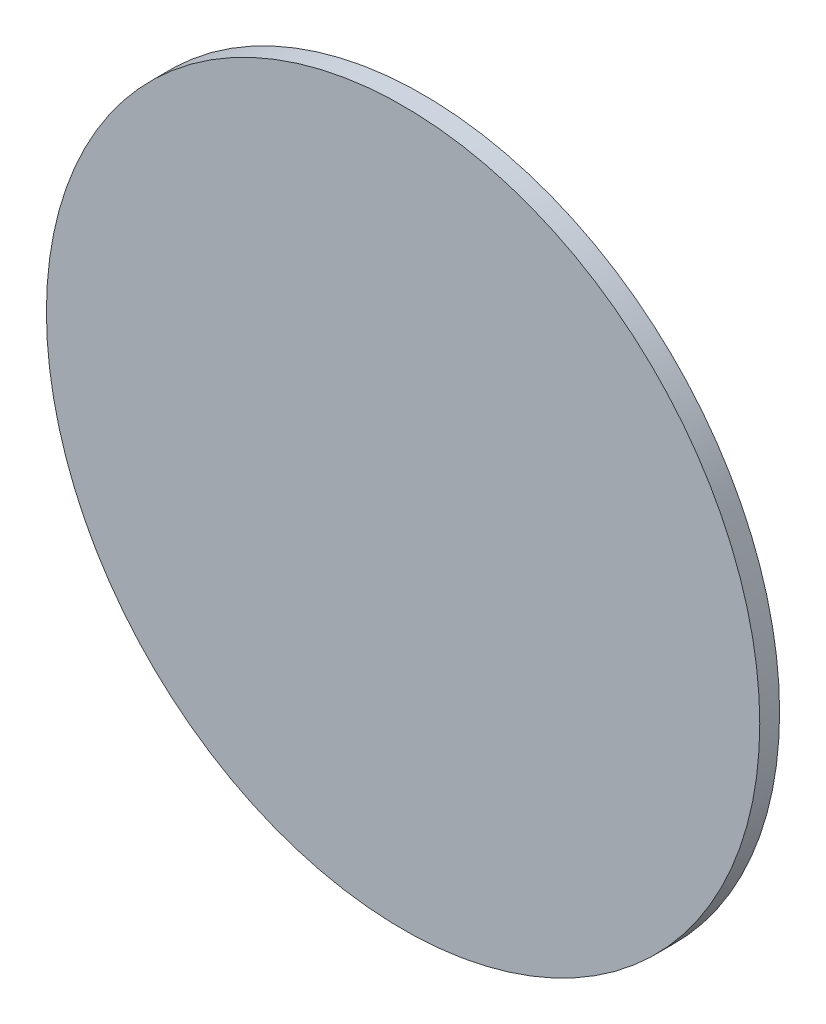
ISO-10303-21;
HEADER;
FILE_DESCRIPTION(('STEP AP214'),'2;1');
FILE_NAME('part.step','',(''),(''),'','','');
FILE_SCHEMA(('AUTOMOTIVE_DESIGN { 1 0 10303 214 1 1 1 1 }'));
ENDSEC;
DATA;
#1=APPLICATION_CONTEXT('core data for automotive mechanical design processes');
#2=APPLICATION_PROTOCOL_DEFINITION('international standard','automotive_design',2000,#1);
#3=PRODUCT_CONTEXT('',#1,'mechanical');
#4=PRODUCT('Part','Part','',(#3));
#5=PRODUCT_RELATED_PRODUCT_CATEGORY('part','',(#4));
#6=PRODUCT_DEFINITION_FORMATION('','',#4);
#7=PRODUCT_DEFINITION_CONTEXT('part definition',#1,'design');
#8=PRODUCT_DEFINITION('design','',#6,#7);
#9=PRODUCT_DEFINITION_SHAPE('','',#8);
#10=(LENGTH_UNIT() NAMED_UNIT(*) SI_UNIT(.MILLI.,.METRE.));
#11=(NAMED_UNIT(*) PLANE_ANGLE_UNIT() SI_UNIT($,.RADIAN.));
#12=(NAMED_UNIT(*) SI_UNIT($,.STERADIAN.) SOLID_ANGLE_UNIT());
#13=UNCERTAINTY_MEASURE_WITH_UNIT(LENGTH_MEASURE(1.E-05),#10,'distance_accuracy_value','');
#14=(GEOMETRIC_REPRESENTATION_CONTEXT(3) GLOBAL_UNCERTAINTY_ASSIGNED_CONTEXT((#13)) GLOBAL_UNIT_ASSIGNED_CONTEXT((#10,
#11,#12)) REPRESENTATION_CONTEXT('',''));
#15=CARTESIAN_POINT('',(0.,0.,0.));
#16=DIRECTION('',(0.,0.,1.));
#17=DIRECTION('',(1.,0.,0.));
#18=AXIS2_PLACEMENT_3D('',#15,#16,#17);
#19=CARTESIAN_POINT('',(0.,0.,2.5));
#20=DIRECTION('',(0.,0.,-1.));
#21=DIRECTION('',(-1.,0.,0.));
#22=AXIS2_PLACEMENT_3D('',#19,#20,#21);
#23=CYLINDRICAL_SURFACE('',#22,89.9999999999999);
#24=CARTESIAN_POINT('',(0.,0.,2.5));
#25=DIRECTION('',(0.,0.,1.));
#26=DIRECTION('',(1.,0.,0.));
#27=AXIS2_PLACEMENT_3D('',#24,#25,#26);
#28=CIRCLE('',#27,89.9999999999999);
#29=CARTESIAN_POINT('',(89.9999999999999,0.,2.5));
#30=VERTEX_POINT('',#29);
#31=EDGE_CURVE('E10',#30,#30,#28,.T.);
#32=ORIENTED_EDGE('',*,*,#31,.F.);
#33=EDGE_LOOP('',(#32));
#34=FACE_BOUND('',#33,.T.);
#35=CARTESIAN_POINT('',(0.,0.,-2.5));
#36=DIRECTION('',(0.,0.,1.));
#37=DIRECTION('',(1.,0.,0.));
#38=AXIS2_PLACEMENT_3D('',#35,#36,#37);
#39=CIRCLE('',#38,89.9999999999999);
#40=CARTESIAN_POINT('',(89.9999999999999,0.,-2.5));
#41=VERTEX_POINT('',#40);
#42=EDGE_CURVE('E40',#41,#41,#39,.T.);
#43=ORIENTED_EDGE('',*,*,#42,.T.);
#44=EDGE_LOOP('',(#43));
#45=FACE_BOUND('',#44,.T.);
#46=ADVANCED_FACE('F37',(#34,#45),#23,.T.);
#47=CARTESIAN_POINT('',(0.,0.,2.5));
#48=DIRECTION('',(0.,0.,1.));
#49=DIRECTION('',(1.,0.,0.));
#50=AXIS2_PLACEMENT_3D('',#47,#48,#49);
#51=PLANE('',#50);
#52=ORIENTED_EDGE('',*,*,#31,.T.);
#53=EDGE_LOOP('',(#52));
#54=FACE_BOUND('',#53,.T.);
#55=ADVANCED_FACE('F54',(#54),#51,.T.);
#56=CARTESIAN_POINT('',(0.,0.,-2.5));
#57=DIRECTION('',(0.,0.,1.));
#58=DIRECTION('',(1.,0.,0.));
#59=AXIS2_PLACEMENT_3D('',#56,#57,#58);
#60=PLANE('',#59);
#61=ORIENTED_EDGE('',*,*,#42,.F.);
#62=EDGE_LOOP('',(#61));
#63=FACE_BOUND('',#62,.T.);
#64=ADVANCED_FACE('F52',(#63),#60,.F.);
#65=CLOSED_SHELL('',(#46,#55,#64));
#66=MANIFOLD_SOLID_BREP('B2',#65);
#67=ADVANCED_BREP_SHAPE_REPRESENTATION('',(#18,#66),#14);
#68=SHAPE_DEFINITION_REPRESENTATION(#9,#67);
ENDSEC;
END-ISO-10303-21;
